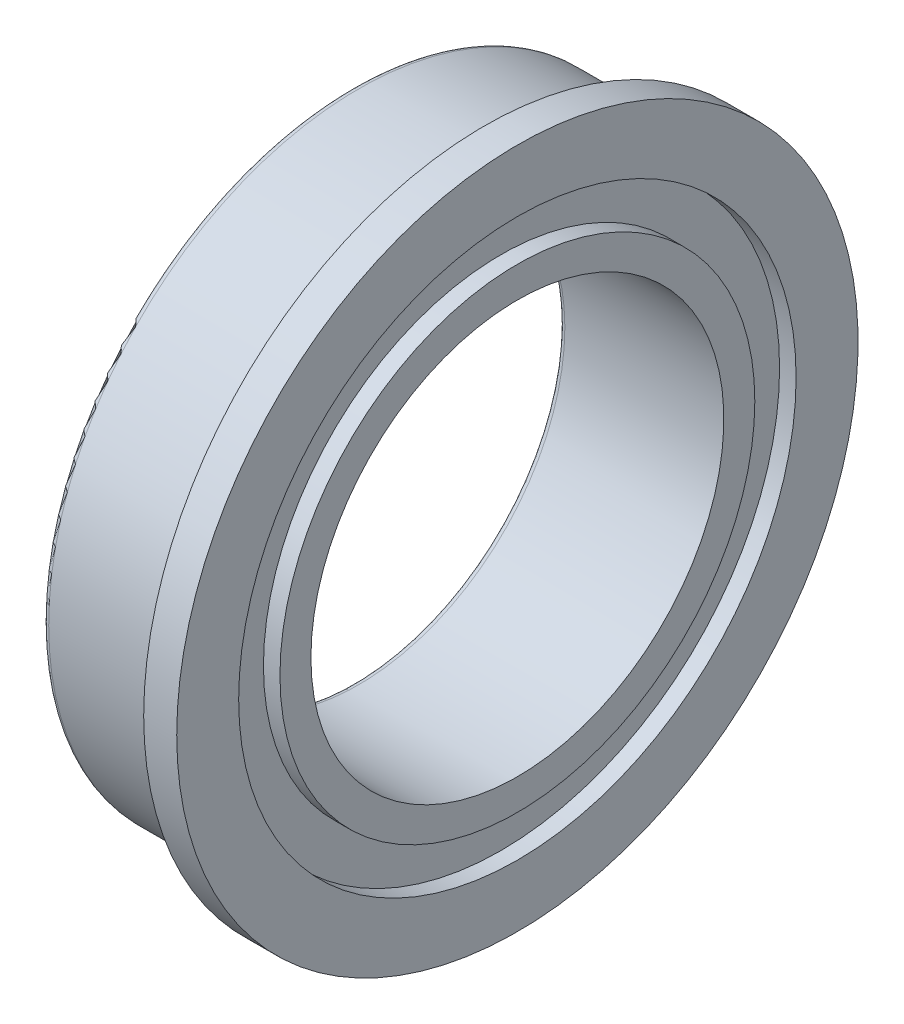
ISO-10303-21;
HEADER;
FILE_DESCRIPTION(('STEP AP214'),'2;1');
FILE_NAME('part.step','',(''),(''),'','','');
FILE_SCHEMA(('AUTOMOTIVE_DESIGN { 1 0 10303 214 1 1 1 1 }'));
ENDSEC;
DATA;
#1=APPLICATION_CONTEXT('core data for automotive mechanical design processes');
#2=APPLICATION_PROTOCOL_DEFINITION('international standard','automotive_design',2000,#1);
#3=PRODUCT_CONTEXT('',#1,'mechanical');
#4=PRODUCT('Part','Part','',(#3));
#5=PRODUCT_RELATED_PRODUCT_CATEGORY('part','',(#4));
#6=PRODUCT_DEFINITION_FORMATION('','',#4);
#7=PRODUCT_DEFINITION_CONTEXT('part definition',#1,'design');
#8=PRODUCT_DEFINITION('design','',#6,#7);
#9=PRODUCT_DEFINITION_SHAPE('','',#8);
#10=(LENGTH_UNIT() NAMED_UNIT(*) SI_UNIT(.MILLI.,.METRE.));
#11=(NAMED_UNIT(*) PLANE_ANGLE_UNIT() SI_UNIT($,.RADIAN.));
#12=(NAMED_UNIT(*) SI_UNIT($,.STERADIAN.) SOLID_ANGLE_UNIT());
#13=UNCERTAINTY_MEASURE_WITH_UNIT(LENGTH_MEASURE(1.E-05),#10,'distance_accuracy_value','');
#14=(GEOMETRIC_REPRESENTATION_CONTEXT(3) GLOBAL_UNCERTAINTY_ASSIGNED_CONTEXT((#13)) GLOBAL_UNIT_ASSIGNED_CONTEXT((#10,
#11,#12)) REPRESENTATION_CONTEXT('',''));
#15=CARTESIAN_POINT('',(0.,0.,0.));
#16=DIRECTION('',(0.,0.,1.));
#17=DIRECTION('',(1.,0.,0.));
#18=AXIS2_PLACEMENT_3D('',#15,#16,#17);
#19=CARTESIAN_POINT('',(2.,6.75,0.));
#20=DIRECTION('',(-1.,0.,0.));
#21=DIRECTION('',(0.,0.,1.));
#22=AXIS2_PLACEMENT_3D('',#19,#20,#21);
#23=PLANE('',#22);
#24=CARTESIAN_POINT('',(2.,0.,0.));
#25=DIRECTION('',(-1.,0.,0.));
#26=DIRECTION('',(0.,0.,1.));
#27=AXIS2_PLACEMENT_3D('',#24,#25,#26);
#28=CIRCLE('',#27,8.25);
#29=CARTESIAN_POINT('',(2.,0.,8.25));
#30=VERTEX_POINT('',#29);
#31=EDGE_CURVE('E65',#30,#30,#28,.T.);
#32=ORIENTED_EDGE('',*,*,#31,.F.);
#33=EDGE_LOOP('',(#32));
#34=FACE_BOUND('',#33,.T.);
#35=CARTESIAN_POINT('',(2.,0.,0.));
#36=DIRECTION('',(-1.,0.,0.));
#37=DIRECTION('',(0.,0.,1.));
#38=AXIS2_PLACEMENT_3D('',#35,#36,#37);
#39=CIRCLE('',#38,6.75);
#40=CARTESIAN_POINT('',(2.,0.,6.75));
#41=VERTEX_POINT('',#40);
#42=EDGE_CURVE('E109',#41,#41,#39,.T.);
#43=ORIENTED_EDGE('',*,*,#42,.T.);
#44=EDGE_LOOP('',(#43));
#45=FACE_BOUND('',#44,.T.);
#46=ADVANCED_FACE('F41',(#34,#45),#23,.F.);
#47=CARTESIAN_POINT('',(-243.027564124036,0.,0.));
#48=DIRECTION('',(-1.,0.,0.));
#49=DIRECTION('',(0.,0.,1.));
#50=AXIS2_PLACEMENT_3D('',#47,#48,#49);
#51=CYLINDRICAL_SURFACE('',#50,8.25);
#52=CARTESIAN_POINT('',(1.20000000000001,0.,0.));
#53=DIRECTION('',(-1.,0.,0.));
#54=DIRECTION('',(0.,0.,1.));
#55=AXIS2_PLACEMENT_3D('',#52,#53,#54);
#56=CIRCLE('',#55,8.25);
#57=CARTESIAN_POINT('',(1.20000000000001,0.,8.25));
#58=VERTEX_POINT('',#57);
#59=EDGE_CURVE('E69',#58,#58,#56,.T.);
#60=ORIENTED_EDGE('',*,*,#59,.F.);
#61=EDGE_LOOP('',(#60));
#62=FACE_BOUND('',#61,.T.);
#63=ORIENTED_EDGE('',*,*,#31,.T.);
#64=EDGE_LOOP('',(#63));
#65=FACE_BOUND('',#64,.T.);
#66=ADVANCED_FACE('F150',(#62,#65),#51,.T.);
#67=CARTESIAN_POINT('',(1.2,8.25,0.));
#68=DIRECTION('',(1.,0.,0.));
#69=DIRECTION('',(0.,0.,-1.));
#70=AXIS2_PLACEMENT_3D('',#67,#68,#69);
#71=PLANE('',#70);
#72=CARTESIAN_POINT('',(1.20000000000001,0.,0.));
#73=DIRECTION('',(-1.,0.,0.));
#74=DIRECTION('',(0.,0.,1.));
#75=AXIS2_PLACEMENT_3D('',#72,#73,#74);
#76=CIRCLE('',#75,7.5);
#77=CARTESIAN_POINT('',(1.20000000000001,0.,7.5));
#78=VERTEX_POINT('',#77);
#79=EDGE_CURVE('E73',#78,#78,#76,.T.);
#80=ORIENTED_EDGE('',*,*,#79,.F.);
#81=EDGE_LOOP('',(#80));
#82=FACE_BOUND('',#81,.T.);
#83=ORIENTED_EDGE('',*,*,#59,.T.);
#84=EDGE_LOOP('',(#83));
#85=FACE_BOUND('',#84,.T.);
#86=ADVANCED_FACE('F156',(#82,#85),#71,.F.);
#87=CARTESIAN_POINT('',(-243.027564124036,0.,0.));
#88=DIRECTION('',(-1.,0.,0.));
#89=DIRECTION('',(0.,0.,1.));
#90=AXIS2_PLACEMENT_3D('',#87,#88,#89);
#91=CYLINDRICAL_SURFACE('',#90,7.5);
#92=CARTESIAN_POINT('',(-1.84999999999999,0.,0.));
#93=DIRECTION('',(1.,0.,0.));
#94=DIRECTION('',(0.,0.,-1.));
#95=AXIS2_PLACEMENT_3D('',#92,#93,#94);
#96=CIRCLE('',#95,7.5);
#97=CARTESIAN_POINT('',(-1.84999999999999,0.,-7.5));
#98=VERTEX_POINT('',#97);
#99=EDGE_CURVE('E54',#98,#98,#96,.T.);
#100=ORIENTED_EDGE('',*,*,#99,.T.);
#101=EDGE_LOOP('',(#100));
#102=FACE_BOUND('',#101,.T.);
#103=ORIENTED_EDGE('',*,*,#79,.T.);
#104=EDGE_LOOP('',(#103));
#105=FACE_BOUND('',#104,.T.);
#106=ADVANCED_FACE('F175',(#102,#105),#91,.T.);
#107=CARTESIAN_POINT('',(-2.,7.5,0.));
#108=DIRECTION('',(1.,0.,0.));
#109=DIRECTION('',(0.,0.,-1.));
#110=AXIS2_PLACEMENT_3D('',#107,#108,#109);
#111=PLANE('',#110);
#112=CARTESIAN_POINT('',(-2.,0.,0.));
#113=DIRECTION('',(1.,0.,0.));
#114=DIRECTION('',(0.,0.,-1.));
#115=AXIS2_PLACEMENT_3D('',#112,#113,#114);
#116=CIRCLE('',#115,7.35);
#117=CARTESIAN_POINT('',(-2.,0.,-7.35));
#118=VERTEX_POINT('',#117);
#119=EDGE_CURVE('E59',#118,#118,#116,.F.);
#120=ORIENTED_EDGE('',*,*,#119,.T.);
#121=EDGE_LOOP('',(#120));
#122=FACE_BOUND('',#121,.T.);
#123=CARTESIAN_POINT('',(-2.,0.,0.));
#124=DIRECTION('',(-1.,0.,0.));
#125=DIRECTION('',(0.,0.,1.));
#126=AXIS2_PLACEMENT_3D('',#123,#124,#125);
#127=CIRCLE('',#126,6.75);
#128=CARTESIAN_POINT('',(-2.,0.,6.75));
#129=VERTEX_POINT('',#128);
#130=EDGE_CURVE('E77',#129,#129,#127,.T.);
#131=ORIENTED_EDGE('',*,*,#130,.F.);
#132=EDGE_LOOP('',(#131));
#133=FACE_BOUND('',#132,.T.);
#134=ADVANCED_FACE('F171',(#122,#133),#111,.F.);
#135=CARTESIAN_POINT('',(-243.027564124036,0.,0.));
#136=DIRECTION('',(-1.,0.,0.));
#137=DIRECTION('',(0.,0.,1.));
#138=AXIS2_PLACEMENT_3D('',#135,#136,#137);
#139=CYLINDRICAL_SURFACE('',#138,6.75);
#140=CARTESIAN_POINT('',(-1.59999999999999,0.,0.));
#141=DIRECTION('',(-1.,0.,0.));
#142=DIRECTION('',(0.,0.,1.));
#143=AXIS2_PLACEMENT_3D('',#140,#141,#142);
#144=CIRCLE('',#143,6.75);
#145=CARTESIAN_POINT('',(-1.59999999999999,0.,6.75));
#146=VERTEX_POINT('',#145);
#147=EDGE_CURVE('E81',#146,#146,#144,.T.);
#148=ORIENTED_EDGE('',*,*,#147,.F.);
#149=EDGE_LOOP('',(#148));
#150=FACE_BOUND('',#149,.T.);
#151=ORIENTED_EDGE('',*,*,#130,.T.);
#152=EDGE_LOOP('',(#151));
#153=FACE_BOUND('',#152,.T.);
#154=ADVANCED_FACE('F174',(#150,#153),#139,.F.);
#155=CARTESIAN_POINT('',(-1.6,6.75,0.));
#156=DIRECTION('',(1.,0.,0.));
#157=DIRECTION('',(0.,0.,-1.));
#158=AXIS2_PLACEMENT_3D('',#155,#156,#157);
#159=PLANE('',#158);
#160=CARTESIAN_POINT('',(-1.59999999999999,0.,0.));
#161=DIRECTION('',(-1.,0.,0.));
#162=DIRECTION('',(0.,0.,1.));
#163=AXIS2_PLACEMENT_3D('',#160,#161,#162);
#164=CIRCLE('',#163,5.75);
#165=CARTESIAN_POINT('',(-1.59999999999999,0.,5.75));
#166=VERTEX_POINT('',#165);
#167=EDGE_CURVE('E85',#166,#166,#164,.T.);
#168=ORIENTED_EDGE('',*,*,#167,.F.);
#169=EDGE_LOOP('',(#168));
#170=FACE_BOUND('',#169,.T.);
#171=ORIENTED_EDGE('',*,*,#147,.T.);
#172=EDGE_LOOP('',(#171));
#173=FACE_BOUND('',#172,.T.);
#174=ADVANCED_FACE('F180',(#170,#173),#159,.F.);
#175=CARTESIAN_POINT('',(-243.027564124036,0.,0.));
#176=DIRECTION('',(-1.,0.,0.));
#177=DIRECTION('',(0.,0.,1.));
#178=AXIS2_PLACEMENT_3D('',#175,#176,#177);
#179=CYLINDRICAL_SURFACE('',#178,5.75);
#180=CARTESIAN_POINT('',(-2.,0.,0.));
#181=DIRECTION('',(-1.,0.,0.));
#182=DIRECTION('',(0.,0.,1.));
#183=AXIS2_PLACEMENT_3D('',#180,#181,#182);
#184=CIRCLE('',#183,5.75);
#185=CARTESIAN_POINT('',(-2.,0.,5.75));
#186=VERTEX_POINT('',#185);
#187=EDGE_CURVE('E89',#186,#186,#184,.T.);
#188=ORIENTED_EDGE('',*,*,#187,.F.);
#189=EDGE_LOOP('',(#188));
#190=FACE_BOUND('',#189,.T.);
#191=ORIENTED_EDGE('',*,*,#167,.T.);
#192=EDGE_LOOP('',(#191));
#193=FACE_BOUND('',#192,.T.);
#194=ADVANCED_FACE('F147',(#190,#193),#179,.T.);
#195=CARTESIAN_POINT('',(-2.,5.75,0.));
#196=DIRECTION('',(1.,0.,0.));
#197=DIRECTION('',(0.,0.,-1.));
#198=AXIS2_PLACEMENT_3D('',#195,#196,#197);
#199=PLANE('',#198);
#200=CARTESIAN_POINT('',(-2.,0.,0.));
#201=DIRECTION('',(1.,0.,0.));
#202=DIRECTION('',(0.,0.,-1.));
#203=AXIS2_PLACEMENT_3D('',#200,#201,#202);
#204=CIRCLE('',#203,5.15);
#205=CARTESIAN_POINT('',(-2.,0.,-5.15));
#206=VERTEX_POINT('',#205);
#207=EDGE_CURVE('E10',#206,#206,#204,.T.);
#208=ORIENTED_EDGE('',*,*,#207,.T.);
#209=EDGE_LOOP('',(#208));
#210=FACE_BOUND('',#209,.T.);
#211=ORIENTED_EDGE('',*,*,#187,.T.);
#212=EDGE_LOOP('',(#211));
#213=FACE_BOUND('',#212,.T.);
#214=ADVANCED_FACE('F142',(#210,#213),#199,.F.);
#215=CARTESIAN_POINT('',(-243.027564124036,0.,0.));
#216=DIRECTION('',(-1.,0.,0.));
#217=DIRECTION('',(0.,0.,1.));
#218=AXIS2_PLACEMENT_3D('',#215,#216,#217);
#219=CYLINDRICAL_SURFACE('',#218,5.);
#220=CARTESIAN_POINT('',(-1.84999999999999,0.,0.));
#221=DIRECTION('',(1.,0.,0.));
#222=DIRECTION('',(0.,0.,-1.));
#223=AXIS2_PLACEMENT_3D('',#220,#221,#222);
#224=CIRCLE('',#223,5.);
#225=CARTESIAN_POINT('',(-1.84999999999999,0.,-5.));
#226=VERTEX_POINT('',#225);
#227=EDGE_CURVE('E49',#226,#226,#224,.F.);
#228=ORIENTED_EDGE('',*,*,#227,.T.);
#229=EDGE_LOOP('',(#228));
#230=FACE_BOUND('',#229,.T.);
#231=CARTESIAN_POINT('',(2.,0.,0.));
#232=DIRECTION('',(-1.,0.,0.));
#233=DIRECTION('',(0.,0.,1.));
#234=AXIS2_PLACEMENT_3D('',#231,#232,#233);
#235=CIRCLE('',#234,5.);
#236=CARTESIAN_POINT('',(2.,0.,5.));
#237=VERTEX_POINT('',#236);
#238=EDGE_CURVE('E93',#237,#237,#235,.T.);
#239=ORIENTED_EDGE('',*,*,#238,.F.);
#240=EDGE_LOOP('',(#239));
#241=FACE_BOUND('',#240,.T.);
#242=ADVANCED_FACE('F137',(#230,#241),#219,.F.);
#243=CARTESIAN_POINT('',(2.,5.,0.));
#244=DIRECTION('',(-1.,0.,0.));
#245=DIRECTION('',(0.,0.,1.));
#246=AXIS2_PLACEMENT_3D('',#243,#244,#245);
#247=PLANE('',#246);
#248=CARTESIAN_POINT('',(2.,0.,0.));
#249=DIRECTION('',(-1.,0.,0.));
#250=DIRECTION('',(0.,0.,1.));
#251=AXIS2_PLACEMENT_3D('',#248,#249,#250);
#252=CIRCLE('',#251,5.75);
#253=CARTESIAN_POINT('',(2.,0.,5.75));
#254=VERTEX_POINT('',#253);
#255=EDGE_CURVE('E97',#254,#254,#252,.T.);
#256=ORIENTED_EDGE('',*,*,#255,.F.);
#257=EDGE_LOOP('',(#256));
#258=FACE_BOUND('',#257,.T.);
#259=ORIENTED_EDGE('',*,*,#238,.T.);
#260=EDGE_LOOP('',(#259));
#261=FACE_BOUND('',#260,.T.);
#262=ADVANCED_FACE('F131',(#258,#261),#247,.F.);
#263=CARTESIAN_POINT('',(-243.027564124036,0.,0.));
#264=DIRECTION('',(-1.,0.,0.));
#265=DIRECTION('',(0.,0.,1.));
#266=AXIS2_PLACEMENT_3D('',#263,#264,#265);
#267=CYLINDRICAL_SURFACE('',#266,5.75);
#268=CARTESIAN_POINT('',(1.59999999999999,0.,0.));
#269=DIRECTION('',(-1.,0.,0.));
#270=DIRECTION('',(0.,0.,1.));
#271=AXIS2_PLACEMENT_3D('',#268,#269,#270);
#272=CIRCLE('',#271,5.75);
#273=CARTESIAN_POINT('',(1.59999999999999,0.,5.75));
#274=VERTEX_POINT('',#273);
#275=EDGE_CURVE('E101',#274,#274,#272,.T.);
#276=ORIENTED_EDGE('',*,*,#275,.F.);
#277=EDGE_LOOP('',(#276));
#278=FACE_BOUND('',#277,.T.);
#279=ORIENTED_EDGE('',*,*,#255,.T.);
#280=EDGE_LOOP('',(#279));
#281=FACE_BOUND('',#280,.T.);
#282=ADVANCED_FACE('F125',(#278,#281),#267,.T.);
#283=CARTESIAN_POINT('',(1.6,5.75,0.));
#284=DIRECTION('',(-1.,0.,0.));
#285=DIRECTION('',(0.,0.,1.));
#286=AXIS2_PLACEMENT_3D('',#283,#284,#285);
#287=PLANE('',#286);
#288=CARTESIAN_POINT('',(1.59999999999999,0.,0.));
#289=DIRECTION('',(-1.,0.,0.));
#290=DIRECTION('',(0.,0.,1.));
#291=AXIS2_PLACEMENT_3D('',#288,#289,#290);
#292=CIRCLE('',#291,6.75);
#293=CARTESIAN_POINT('',(1.59999999999999,0.,6.75));
#294=VERTEX_POINT('',#293);
#295=EDGE_CURVE('E105',#294,#294,#292,.T.);
#296=ORIENTED_EDGE('',*,*,#295,.F.);
#297=EDGE_LOOP('',(#296));
#298=FACE_BOUND('',#297,.T.);
#299=ORIENTED_EDGE('',*,*,#275,.T.);
#300=EDGE_LOOP('',(#299));
#301=FACE_BOUND('',#300,.T.);
#302=ADVANCED_FACE('F119',(#298,#301),#287,.F.);
#303=CARTESIAN_POINT('',(-243.027564124036,0.,0.));
#304=DIRECTION('',(-1.,0.,0.));
#305=DIRECTION('',(0.,0.,1.));
#306=AXIS2_PLACEMENT_3D('',#303,#304,#305);
#307=CYLINDRICAL_SURFACE('',#306,6.75);
#308=ORIENTED_EDGE('',*,*,#42,.F.);
#309=EDGE_LOOP('',(#308));
#310=FACE_BOUND('',#309,.T.);
#311=ORIENTED_EDGE('',*,*,#295,.T.);
#312=EDGE_LOOP('',(#311));
#313=FACE_BOUND('',#312,.T.);
#314=ADVANCED_FACE('F115',(#310,#313),#307,.F.);
#315=CARTESIAN_POINT('',(-1.84999999999999,0.,0.));
#316=DIRECTION('',(1.,0.,0.));
#317=DIRECTION('',(0.,0.,-1.));
#318=AXIS2_PLACEMENT_3D('',#315,#316,#317);
#319=TOROIDAL_SURFACE('',#318,7.35,0.15);
#320=ORIENTED_EDGE('',*,*,#99,.F.);
#321=EDGE_LOOP('',(#320));
#322=FACE_BOUND('',#321,.T.);
#323=ORIENTED_EDGE('',*,*,#119,.F.);
#324=EDGE_LOOP('',(#323));
#325=FACE_BOUND('',#324,.T.);
#326=ADVANCED_FACE('F118',(#322,#325),#319,.T.);
#327=CARTESIAN_POINT('',(-1.84999999999999,0.,0.));
#328=DIRECTION('',(1.,0.,0.));
#329=DIRECTION('',(0.,0.,-1.));
#330=AXIS2_PLACEMENT_3D('',#327,#328,#329);
#331=TOROIDAL_SURFACE('',#330,5.15,0.15);
#332=ORIENTED_EDGE('',*,*,#207,.F.);
#333=EDGE_LOOP('',(#332));
#334=FACE_BOUND('',#333,.T.);
#335=ORIENTED_EDGE('',*,*,#227,.F.);
#336=EDGE_LOOP('',(#335));
#337=FACE_BOUND('',#336,.T.);
#338=ADVANCED_FACE('F43',(#334,#337),#331,.T.);
#339=CLOSED_SHELL('',(#46,#66,#86,#106,#134,#154,#174,#194,#214,#242,#262,#282,#302,#314,#326,#338));
#340=MANIFOLD_SOLID_BREP('B2',#339);
#341=ADVANCED_BREP_SHAPE_REPRESENTATION('',(#18,#340),#14);
#342=SHAPE_DEFINITION_REPRESENTATION(#9,#341);
ENDSEC;
END-ISO-10303-21;
